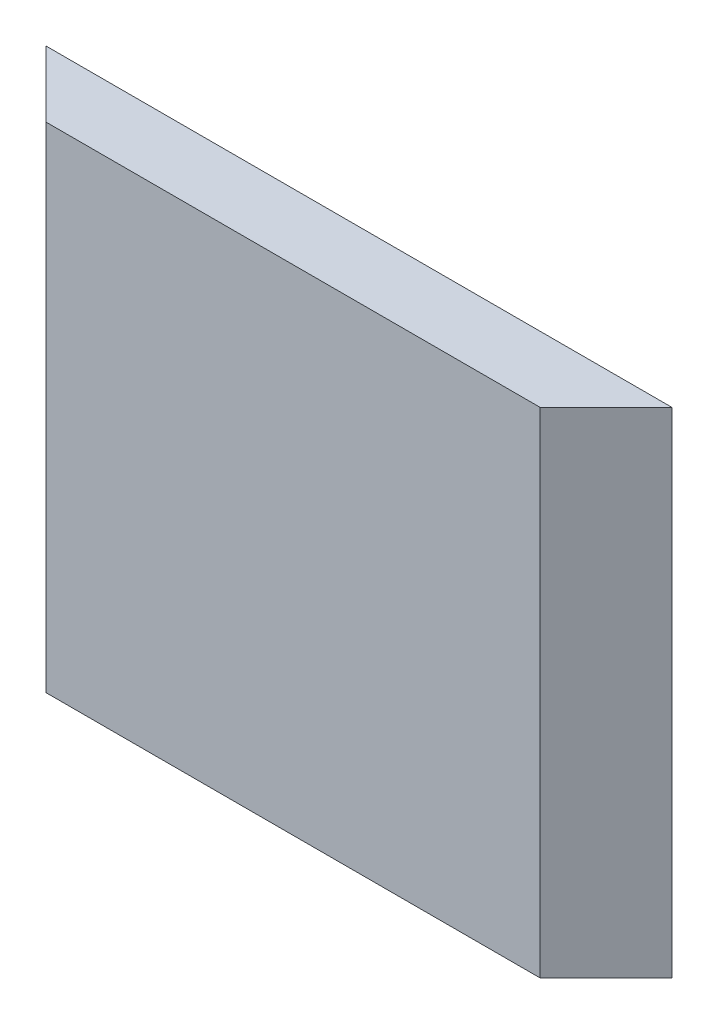
ISO-10303-21;
HEADER;
FILE_DESCRIPTION(('STEP AP214'),'2;1');
FILE_NAME('part.step','',(''),(''),'','','');
FILE_SCHEMA(('AUTOMOTIVE_DESIGN { 1 0 10303 214 1 1 1 1 }'));
ENDSEC;
DATA;
#1=APPLICATION_CONTEXT('core data for automotive mechanical design processes');
#2=APPLICATION_PROTOCOL_DEFINITION('international standard','automotive_design',2000,#1);
#3=PRODUCT_CONTEXT('',#1,'mechanical');
#4=PRODUCT('Part','Part','',(#3));
#5=PRODUCT_RELATED_PRODUCT_CATEGORY('part','',(#4));
#6=PRODUCT_DEFINITION_FORMATION('','',#4);
#7=PRODUCT_DEFINITION_CONTEXT('part definition',#1,'design');
#8=PRODUCT_DEFINITION('design','',#6,#7);
#9=PRODUCT_DEFINITION_SHAPE('','',#8);
#10=(LENGTH_UNIT() NAMED_UNIT(*) SI_UNIT(.MILLI.,.METRE.));
#11=(NAMED_UNIT(*) PLANE_ANGLE_UNIT() SI_UNIT($,.RADIAN.));
#12=(NAMED_UNIT(*) SI_UNIT($,.STERADIAN.) SOLID_ANGLE_UNIT());
#13=UNCERTAINTY_MEASURE_WITH_UNIT(LENGTH_MEASURE(1.E-05),#10,'distance_accuracy_value','');
#14=(GEOMETRIC_REPRESENTATION_CONTEXT(3) GLOBAL_UNCERTAINTY_ASSIGNED_CONTEXT((#13)) GLOBAL_UNIT_ASSIGNED_CONTEXT((#10,
#11,#12)) REPRESENTATION_CONTEXT('',''));
#15=CARTESIAN_POINT('',(0.,0.,0.));
#16=DIRECTION('',(0.,0.,1.));
#17=DIRECTION('',(1.,0.,0.));
#18=AXIS2_PLACEMENT_3D('',#15,#16,#17);
#19=CARTESIAN_POINT('',(-140.500000000009,-30.0000000000039,4.));
#20=DIRECTION('',(0.,1.,0.));
#21=DIRECTION('',(-1.,0.,0.));
#22=AXIS2_PLACEMENT_3D('',#19,#20,#21);
#23=PLANE('',#22);
#24=DIRECTION('',(1.,0.,0.));
#25=VECTOR('',#24,1.);
#26=CARTESIAN_POINT('',(-140.500000000009,-30.0000000000039,4.));
#27=LINE('',#26,#25);
#28=CARTESIAN_POINT('',(-175.500000000009,-30.0000000000039,4.));
#29=VERTEX_POINT('',#28);
#30=CARTESIAN_POINT('',(-145.500000000009,-30.0000000000039,4.));
#31=VERTEX_POINT('',#30);
#32=EDGE_CURVE('E97',#29,#31,#27,.T.);
#33=ORIENTED_EDGE('',*,*,#32,.F.);
#34=DIRECTION('',(0.707106781186551,0.,0.707106781186544));
#35=VECTOR('',#34,1.);
#36=CARTESIAN_POINT('',(-175.500000000009,-30.0000000000039,4.));
#37=LINE('',#36,#35);
#38=CARTESIAN_POINT('',(-179.500000000009,-30.0000000000039,0.));
#39=VERTEX_POINT('',#38);
#40=EDGE_CURVE('E82',#29,#39,#37,.F.);
#41=ORIENTED_EDGE('',*,*,#40,.T.);
#42=DIRECTION('',(1.,0.,0.));
#43=VECTOR('',#42,1.);
#44=CARTESIAN_POINT('',(-140.500000000009,-30.0000000000039,0.));
#45=LINE('',#44,#43);
#46=CARTESIAN_POINT('',(-141.500000000009,-30.0000000000039,0.));
#47=VERTEX_POINT('',#46);
#48=EDGE_CURVE('E107',#39,#47,#45,.T.);
#49=ORIENTED_EDGE('',*,*,#48,.T.);
#50=DIRECTION('',(0.707106781186551,0.,-0.707106781186544));
#51=VECTOR('',#50,1.);
#52=CARTESIAN_POINT('',(-145.500000000009,-30.0000000000039,4.));
#53=LINE('',#52,#51);
#54=EDGE_CURVE('E95',#47,#31,#53,.F.);
#55=ORIENTED_EDGE('',*,*,#54,.T.);
#56=EDGE_LOOP('',(#33,#41,#49,#55));
#57=FACE_BOUND('',#56,.T.);
#58=ADVANCED_FACE('F43',(#57),#23,.F.);
#59=CARTESIAN_POINT('',(-180.500000000009,-3.85108611666851E-12,4.));
#60=DIRECTION('',(0.,-1.,0.));
#61=DIRECTION('',(1.,0.,0.));
#62=AXIS2_PLACEMENT_3D('',#59,#60,#61);
#63=PLANE('',#62);
#64=DIRECTION('',(-1.,0.,0.));
#65=VECTOR('',#64,1.);
#66=CARTESIAN_POINT('',(-180.500000000009,-3.85108611666851E-12,0.));
#67=LINE('',#66,#65);
#68=CARTESIAN_POINT('',(-141.500000000009,-3.80372816577434E-12,0.));
#69=VERTEX_POINT('',#68);
#70=CARTESIAN_POINT('',(-179.500000000009,-3.84987181023533E-12,0.));
#71=VERTEX_POINT('',#70);
#72=EDGE_CURVE('E104',#69,#71,#67,.T.);
#73=ORIENTED_EDGE('',*,*,#72,.T.);
#74=DIRECTION('',(-0.707106781186551,0.,-0.707106781186544));
#75=VECTOR('',#74,1.);
#76=CARTESIAN_POINT('',(-175.500000000009,-3.84501458450259E-12,4.));
#77=LINE('',#76,#75);
#78=CARTESIAN_POINT('',(-175.500000000009,-3.84501458450259E-12,4.));
#79=VERTEX_POINT('',#78);
#80=EDGE_CURVE('E11',#71,#79,#77,.F.);
#81=ORIENTED_EDGE('',*,*,#80,.T.);
#82=DIRECTION('',(-1.,0.,0.));
#83=VECTOR('',#82,1.);
#84=CARTESIAN_POINT('',(-180.500000000009,-3.85108611666851E-12,4.));
#85=LINE('',#84,#83);
#86=CARTESIAN_POINT('',(-145.500000000009,-3.80858539150708E-12,4.));
#87=VERTEX_POINT('',#86);
#88=EDGE_CURVE('E101',#87,#79,#85,.T.);
#89=ORIENTED_EDGE('',*,*,#88,.F.);
#90=DIRECTION('',(-0.707106781186551,0.,0.707106781186544));
#91=VECTOR('',#90,1.);
#92=CARTESIAN_POINT('',(-145.500000000009,-3.80858539150708E-12,4.));
#93=LINE('',#92,#91);
#94=EDGE_CURVE('E55',#87,#69,#93,.F.);
#95=ORIENTED_EDGE('',*,*,#94,.T.);
#96=EDGE_LOOP('',(#73,#81,#89,#95));
#97=FACE_BOUND('',#96,.T.);
#98=ADVANCED_FACE('F119',(#97),#63,.F.);
#99=CARTESIAN_POINT('',(0.,0.,4.));
#100=DIRECTION('',(0.,0.,-1.));
#101=DIRECTION('',(-1.,0.,0.));
#102=AXIS2_PLACEMENT_3D('',#99,#100,#101);
#103=PLANE('',#102);
#104=ORIENTED_EDGE('',*,*,#88,.T.);
#105=DIRECTION('',(0.,-1.,0.));
#106=VECTOR('',#105,1.);
#107=CARTESIAN_POINT('',(-175.500000000009,0.,4.));
#108=LINE('',#107,#106);
#109=EDGE_CURVE('E87',#79,#29,#108,.T.);
#110=ORIENTED_EDGE('',*,*,#109,.T.);
#111=ORIENTED_EDGE('',*,*,#32,.T.);
#112=DIRECTION('',(0.,1.,0.));
#113=VECTOR('',#112,1.);
#114=CARTESIAN_POINT('',(-145.500000000009,0.,4.));
#115=LINE('',#114,#113);
#116=EDGE_CURVE('E105',#31,#87,#115,.T.);
#117=ORIENTED_EDGE('',*,*,#116,.T.);
#118=EDGE_LOOP('',(#104,#110,#111,#117));
#119=FACE_BOUND('',#118,.T.);
#120=ADVANCED_FACE('F100',(#119),#103,.F.);
#121=CARTESIAN_POINT('',(0.,0.,0.));
#122=DIRECTION('',(0.,0.,-1.));
#123=DIRECTION('',(-1.,0.,0.));
#124=AXIS2_PLACEMENT_3D('',#121,#122,#123);
#125=PLANE('',#124);
#126=ORIENTED_EDGE('',*,*,#48,.F.);
#127=DIRECTION('',(0.,-1.,0.));
#128=VECTOR('',#127,1.);
#129=CARTESIAN_POINT('',(-179.500000000009,0.,0.));
#130=LINE('',#129,#128);
#131=EDGE_CURVE('E56',#39,#71,#130,.F.);
#132=ORIENTED_EDGE('',*,*,#131,.T.);
#133=ORIENTED_EDGE('',*,*,#72,.F.);
#134=DIRECTION('',(0.,1.,0.));
#135=VECTOR('',#134,1.);
#136=CARTESIAN_POINT('',(-141.500000000009,0.,0.));
#137=LINE('',#136,#135);
#138=EDGE_CURVE('E93',#69,#47,#137,.F.);
#139=ORIENTED_EDGE('',*,*,#138,.T.);
#140=EDGE_LOOP('',(#126,#132,#133,#139));
#141=FACE_BOUND('',#140,.T.);
#142=ADVANCED_FACE('F117',(#141),#125,.T.);
#143=CARTESIAN_POINT('',(-175.500000000009,0.,4.));
#144=DIRECTION('',(0.707106781186544,0.,-0.707106781186551));
#145=DIRECTION('',(0.,-1.,0.));
#146=AXIS2_PLACEMENT_3D('',#143,#144,#145);
#147=PLANE('',#146);
#148=ORIENTED_EDGE('',*,*,#80,.F.);
#149=ORIENTED_EDGE('',*,*,#131,.F.);
#150=ORIENTED_EDGE('',*,*,#40,.F.);
#151=ORIENTED_EDGE('',*,*,#109,.F.);
#152=EDGE_LOOP('',(#148,#149,#150,#151));
#153=FACE_BOUND('',#152,.T.);
#154=ADVANCED_FACE('F88',(#153),#147,.F.);
#155=CARTESIAN_POINT('',(-145.500000000009,0.,4.));
#156=DIRECTION('',(-0.707106781186544,0.,-0.707106781186551));
#157=DIRECTION('',(0.,1.,0.));
#158=AXIS2_PLACEMENT_3D('',#155,#156,#157);
#159=PLANE('',#158);
#160=ORIENTED_EDGE('',*,*,#54,.F.);
#161=ORIENTED_EDGE('',*,*,#138,.F.);
#162=ORIENTED_EDGE('',*,*,#94,.F.);
#163=ORIENTED_EDGE('',*,*,#116,.F.);
#164=EDGE_LOOP('',(#160,#161,#162,#163));
#165=FACE_BOUND('',#164,.T.);
#166=ADVANCED_FACE('F46',(#165),#159,.F.);
#167=CLOSED_SHELL('',(#58,#98,#120,#142,#154,#166));
#168=MANIFOLD_SOLID_BREP('B2',#167);
#169=ADVANCED_BREP_SHAPE_REPRESENTATION('',(#18,#168),#14);
#170=SHAPE_DEFINITION_REPRESENTATION(#9,#169);
ENDSEC;
END-ISO-10303-21;
